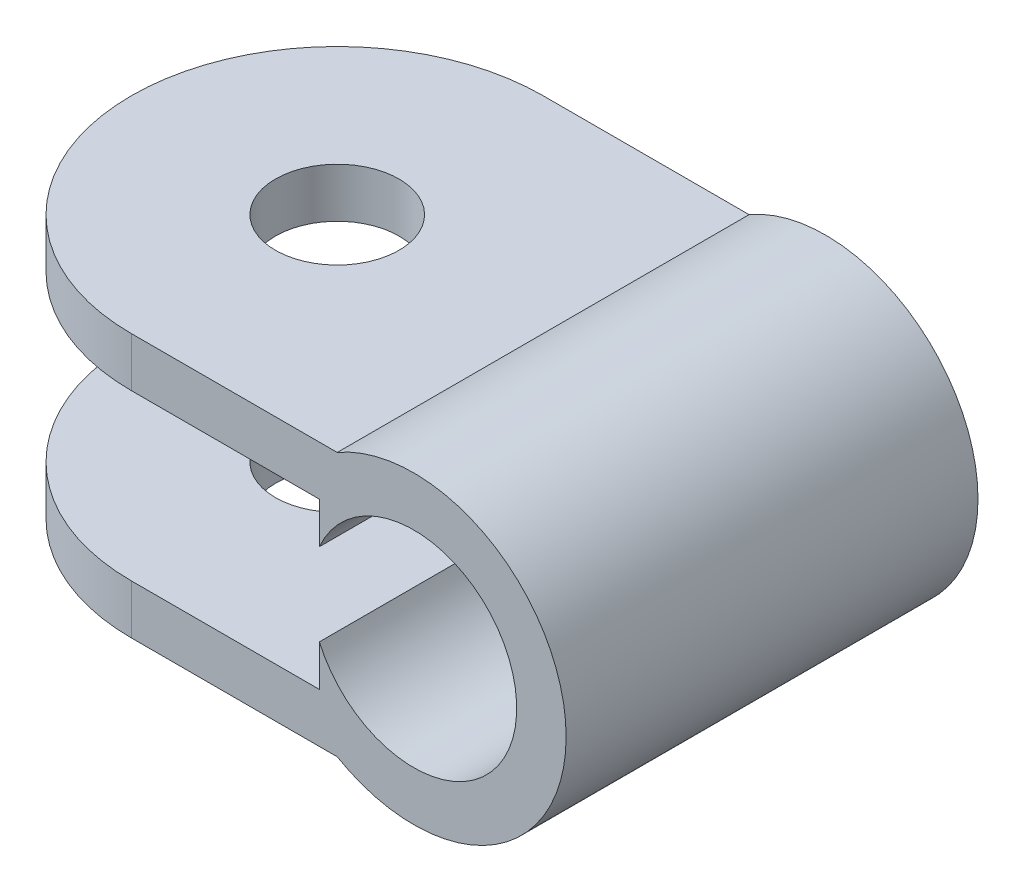
ISO-10303-21;
HEADER;
FILE_DESCRIPTION(('STEP AP214'),'2;1');
FILE_NAME('part.step','',(''),(''),'','','');
FILE_SCHEMA(('AUTOMOTIVE_DESIGN { 1 0 10303 214 1 1 1 1 }'));
ENDSEC;
DATA;
#1=APPLICATION_CONTEXT('core data for automotive mechanical design processes');
#2=APPLICATION_PROTOCOL_DEFINITION('international standard','automotive_design',2000,#1);
#3=PRODUCT_CONTEXT('',#1,'mechanical');
#4=PRODUCT('Part','Part','',(#3));
#5=PRODUCT_RELATED_PRODUCT_CATEGORY('part','',(#4));
#6=PRODUCT_DEFINITION_FORMATION('','',#4);
#7=PRODUCT_DEFINITION_CONTEXT('part definition',#1,'design');
#8=PRODUCT_DEFINITION('design','',#6,#7);
#9=PRODUCT_DEFINITION_SHAPE('','',#8);
#10=(LENGTH_UNIT() NAMED_UNIT(*) SI_UNIT(.MILLI.,.METRE.));
#11=(NAMED_UNIT(*) PLANE_ANGLE_UNIT() SI_UNIT($,.RADIAN.));
#12=(NAMED_UNIT(*) SI_UNIT($,.STERADIAN.) SOLID_ANGLE_UNIT());
#13=UNCERTAINTY_MEASURE_WITH_UNIT(LENGTH_MEASURE(1.E-05),#10,'distance_accuracy_value','');
#14=(GEOMETRIC_REPRESENTATION_CONTEXT(3) GLOBAL_UNCERTAINTY_ASSIGNED_CONTEXT((#13)) GLOBAL_UNIT_ASSIGNED_CONTEXT((#10,
#11,#12)) REPRESENTATION_CONTEXT('',''));
#15=CARTESIAN_POINT('',(0.,0.,0.));
#16=DIRECTION('',(0.,0.,1.));
#17=DIRECTION('',(1.,0.,0.));
#18=AXIS2_PLACEMENT_3D('',#15,#16,#17);
#19=CARTESIAN_POINT('',(0.,0.,5.));
#20=DIRECTION('',(0.,0.,-1.));
#21=DIRECTION('',(-1.,0.,0.));
#22=AXIS2_PLACEMENT_3D('',#19,#20,#21);
#23=CYLINDRICAL_SURFACE('',#22,2.5);
#24=CARTESIAN_POINT('',(0.,0.,-5.));
#25=DIRECTION('',(0.,0.,-1.));
#26=DIRECTION('',(-1.,0.,0.));
#27=AXIS2_PLACEMENT_3D('',#24,#25,#26);
#28=CIRCLE('',#27,2.5);
#29=CARTESIAN_POINT('',(-2.29128784747792,1.,-5.));
#30=VERTEX_POINT('',#29);
#31=CARTESIAN_POINT('',(-2.29128784747792,-1.,-5.));
#32=VERTEX_POINT('',#31);
#33=EDGE_CURVE('E157',#30,#32,#28,.T.);
#34=ORIENTED_EDGE('',*,*,#33,.T.);
#35=DIRECTION('',(0.,0.,-1.));
#36=VECTOR('',#35,1.);
#37=CARTESIAN_POINT('',(-2.29128784747792,-1.,5.));
#38=LINE('',#37,#36);
#39=CARTESIAN_POINT('',(-2.29128784747792,-1.,5.));
#40=VERTEX_POINT('',#39);
#41=EDGE_CURVE('E202',#40,#32,#38,.T.);
#42=ORIENTED_EDGE('',*,*,#41,.F.);
#43=CARTESIAN_POINT('',(0.,0.,5.));
#44=DIRECTION('',(0.,0.,-1.));
#45=DIRECTION('',(-1.,0.,0.));
#46=AXIS2_PLACEMENT_3D('',#43,#44,#45);
#47=CIRCLE('',#46,2.5);
#48=CARTESIAN_POINT('',(-2.29128784747792,1.,5.));
#49=VERTEX_POINT('',#48);
#50=EDGE_CURVE('E183',#49,#40,#47,.T.);
#51=ORIENTED_EDGE('',*,*,#50,.F.);
#52=DIRECTION('',(0.,0.,-1.));
#53=VECTOR('',#52,1.);
#54=CARTESIAN_POINT('',(-2.29128784747792,1.,5.));
#55=LINE('',#54,#53);
#56=EDGE_CURVE('E156',#49,#30,#55,.T.);
#57=ORIENTED_EDGE('',*,*,#56,.T.);
#58=EDGE_LOOP('',(#34,#42,#51,#57));
#59=FACE_BOUND('',#58,.T.);
#60=ADVANCED_FACE('F43',(#59),#23,.F.);
#61=CARTESIAN_POINT('',(-2.29128784747792,-1.,5.));
#62=DIRECTION('',(1.,0.,0.));
#63=DIRECTION('',(0.,1.,0.));
#64=AXIS2_PLACEMENT_3D('',#61,#62,#63);
#65=PLANE('',#64);
#66=DIRECTION('',(0.,-1.,0.));
#67=VECTOR('',#66,1.);
#68=CARTESIAN_POINT('',(-2.29128784747792,-1.,-5.));
#69=LINE('',#68,#67);
#70=CARTESIAN_POINT('',(-2.29128784747792,-2.,-5.));
#71=VERTEX_POINT('',#70);
#72=EDGE_CURVE('E161',#32,#71,#69,.T.);
#73=ORIENTED_EDGE('',*,*,#72,.T.);
#74=DIRECTION('',(0.,0.,-1.));
#75=VECTOR('',#74,1.);
#76=CARTESIAN_POINT('',(-2.29128784747792,-2.,5.));
#77=LINE('',#76,#75);
#78=CARTESIAN_POINT('',(-2.29128784747792,-2.,5.));
#79=VERTEX_POINT('',#78);
#80=EDGE_CURVE('E198',#79,#71,#77,.T.);
#81=ORIENTED_EDGE('',*,*,#80,.F.);
#82=DIRECTION('',(0.,-1.,0.));
#83=VECTOR('',#82,1.);
#84=CARTESIAN_POINT('',(-2.29128784747792,-1.,5.));
#85=LINE('',#84,#83);
#86=EDGE_CURVE('E249',#40,#79,#85,.T.);
#87=ORIENTED_EDGE('',*,*,#86,.F.);
#88=ORIENTED_EDGE('',*,*,#41,.T.);
#89=EDGE_LOOP('',(#73,#81,#87,#88));
#90=FACE_BOUND('',#89,.T.);
#91=ADVANCED_FACE('F236',(#90),#65,.F.);
#92=CARTESIAN_POINT('',(-2.29128784747792,-2.,5.));
#93=DIRECTION('',(0.,-1.,0.));
#94=DIRECTION('',(1.,0.,0.));
#95=AXIS2_PLACEMENT_3D('',#92,#93,#94);
#96=PLANE('',#95);
#97=CARTESIAN_POINT('',(-6.85741756210067,-2.,0.));
#98=DIRECTION('',(0.,-1.,0.));
#99=DIRECTION('',(1.,0.,0.));
#100=AXIS2_PLACEMENT_3D('',#97,#98,#99);
#101=CIRCLE('',#100,1.5);
#102=CARTESIAN_POINT('',(-5.35741756210067,-2.,0.));
#103=VERTEX_POINT('',#102);
#104=EDGE_CURVE('E162',#103,#103,#101,.T.);
#105=ORIENTED_EDGE('',*,*,#104,.T.);
#106=EDGE_LOOP('',(#105));
#107=FACE_BOUND('',#106,.T.);
#108=DIRECTION('',(-1.,0.,0.));
#109=VECTOR('',#108,1.);
#110=CARTESIAN_POINT('',(-2.29128784747792,-2.,-5.));
#111=LINE('',#110,#109);
#112=CARTESIAN_POINT('',(-6.85741756210067,-2.,-5.));
#113=VERTEX_POINT('',#112);
#114=EDGE_CURVE('E165',#71,#113,#111,.T.);
#115=ORIENTED_EDGE('',*,*,#114,.T.);
#116=CARTESIAN_POINT('',(-6.85741756210067,-2.,0.));
#117=DIRECTION('',(0.,-1.,0.));
#118=DIRECTION('',(1.,0.,0.));
#119=AXIS2_PLACEMENT_3D('',#116,#117,#118);
#120=CIRCLE('',#119,5.);
#121=CARTESIAN_POINT('',(-6.85741756210067,-2.,5.));
#122=VERTEX_POINT('',#121);
#123=EDGE_CURVE('E59',#113,#122,#120,.F.);
#124=ORIENTED_EDGE('',*,*,#123,.T.);
#125=DIRECTION('',(-1.,0.,0.));
#126=VECTOR('',#125,1.);
#127=CARTESIAN_POINT('',(-2.29128784747792,-2.,5.));
#128=LINE('',#127,#126);
#129=EDGE_CURVE('E254',#79,#122,#128,.T.);
#130=ORIENTED_EDGE('',*,*,#129,.F.);
#131=ORIENTED_EDGE('',*,*,#80,.T.);
#132=EDGE_LOOP('',(#115,#124,#130,#131));
#133=FACE_BOUND('',#132,.T.);
#134=ADVANCED_FACE('F232',(#107,#133),#96,.F.);
#135=CARTESIAN_POINT('',(-11.8574175621007,-3.2,5.));
#136=DIRECTION('',(0.,1.,0.));
#137=DIRECTION('',(-1.,0.,0.));
#138=AXIS2_PLACEMENT_3D('',#135,#136,#137);
#139=PLANE('',#138);
#140=CARTESIAN_POINT('',(-6.85741756210067,-3.2,0.));
#141=DIRECTION('',(0.,1.,0.));
#142=DIRECTION('',(-1.,0.,0.));
#143=AXIS2_PLACEMENT_3D('',#140,#141,#142);
#144=CIRCLE('',#143,1.5);
#145=CARTESIAN_POINT('',(-8.35741756210067,-3.2,0.));
#146=VERTEX_POINT('',#145);
#147=EDGE_CURVE('E272',#146,#146,#144,.T.);
#148=ORIENTED_EDGE('',*,*,#147,.T.);
#149=EDGE_LOOP('',(#148));
#150=FACE_BOUND('',#149,.T.);
#151=DIRECTION('',(1.,0.,0.));
#152=VECTOR('',#151,1.);
#153=CARTESIAN_POINT('',(-11.8574175621007,-3.2,5.));
#154=LINE('',#153,#152);
#155=CARTESIAN_POINT('',(-6.85741756210067,-3.2,5.));
#156=VERTEX_POINT('',#155);
#157=CARTESIAN_POINT('',(-1.85741756210067,-3.2,5.));
#158=VERTEX_POINT('',#157);
#159=EDGE_CURVE('E150',#156,#158,#154,.T.);
#160=ORIENTED_EDGE('',*,*,#159,.F.);
#161=CARTESIAN_POINT('',(-6.85741756210067,-3.2,0.));
#162=DIRECTION('',(0.,1.,0.));
#163=DIRECTION('',(-1.,0.,0.));
#164=AXIS2_PLACEMENT_3D('',#161,#162,#163);
#165=CIRCLE('',#164,5.);
#166=CARTESIAN_POINT('',(-6.85741756210067,-3.2,-5.));
#167=VERTEX_POINT('',#166);
#168=EDGE_CURVE('E208',#156,#167,#165,.F.);
#169=ORIENTED_EDGE('',*,*,#168,.T.);
#170=DIRECTION('',(1.,0.,0.));
#171=VECTOR('',#170,1.);
#172=CARTESIAN_POINT('',(-11.8574175621007,-3.2,-5.));
#173=LINE('',#172,#171);
#174=CARTESIAN_POINT('',(-1.85741756210067,-3.2,-5.));
#175=VERTEX_POINT('',#174);
#176=EDGE_CURVE('E169',#167,#175,#173,.T.);
#177=ORIENTED_EDGE('',*,*,#176,.T.);
#178=DIRECTION('',(0.,0.,-1.));
#179=VECTOR('',#178,1.);
#180=CARTESIAN_POINT('',(-1.85741756210067,-3.2,5.));
#181=LINE('',#180,#179);
#182=EDGE_CURVE('E194',#158,#175,#181,.T.);
#183=ORIENTED_EDGE('',*,*,#182,.F.);
#184=EDGE_LOOP('',(#160,#169,#177,#183));
#185=FACE_BOUND('',#184,.T.);
#186=ADVANCED_FACE('F215',(#150,#185),#139,.F.);
#187=CARTESIAN_POINT('',(0.,0.,5.));
#188=DIRECTION('',(0.,0.,-1.));
#189=DIRECTION('',(-1.,0.,0.));
#190=AXIS2_PLACEMENT_3D('',#187,#188,#189);
#191=CYLINDRICAL_SURFACE('',#190,3.7);
#192=CARTESIAN_POINT('',(0.,0.,-5.));
#193=DIRECTION('',(0.,0.,1.));
#194=DIRECTION('',(-1.,0.,0.));
#195=AXIS2_PLACEMENT_3D('',#192,#193,#194);
#196=CIRCLE('',#195,3.7);
#197=CARTESIAN_POINT('',(-1.85741756210067,3.2,-5.));
#198=VERTEX_POINT('',#197);
#199=EDGE_CURVE('E172',#175,#198,#196,.T.);
#200=ORIENTED_EDGE('',*,*,#199,.T.);
#201=DIRECTION('',(0.,0.,-1.));
#202=VECTOR('',#201,1.);
#203=CARTESIAN_POINT('',(-1.85741756210067,3.2,5.));
#204=LINE('',#203,#202);
#205=CARTESIAN_POINT('',(-1.85741756210067,3.2,5.));
#206=VERTEX_POINT('',#205);
#207=EDGE_CURVE('E191',#206,#198,#204,.T.);
#208=ORIENTED_EDGE('',*,*,#207,.F.);
#209=CARTESIAN_POINT('',(0.,0.,5.));
#210=DIRECTION('',(0.,0.,1.));
#211=DIRECTION('',(-1.,0.,0.));
#212=AXIS2_PLACEMENT_3D('',#209,#210,#211);
#213=CIRCLE('',#212,3.7);
#214=EDGE_CURVE('E141',#158,#206,#213,.T.);
#215=ORIENTED_EDGE('',*,*,#214,.F.);
#216=ORIENTED_EDGE('',*,*,#182,.T.);
#217=EDGE_LOOP('',(#200,#208,#215,#216));
#218=FACE_BOUND('',#217,.T.);
#219=ADVANCED_FACE('F222',(#218),#191,.T.);
#220=CARTESIAN_POINT('',(-11.8574175621007,3.2,5.));
#221=DIRECTION('',(0.,-1.,0.));
#222=DIRECTION('',(1.,0.,0.));
#223=AXIS2_PLACEMENT_3D('',#220,#221,#222);
#224=PLANE('',#223);
#225=CARTESIAN_POINT('',(-6.85741756210067,3.2,0.));
#226=DIRECTION('',(0.,1.,0.));
#227=DIRECTION('',(-1.,0.,0.));
#228=AXIS2_PLACEMENT_3D('',#225,#226,#227);
#229=CIRCLE('',#228,1.5);
#230=CARTESIAN_POINT('',(-8.35741756210067,3.2,0.));
#231=VERTEX_POINT('',#230);
#232=EDGE_CURVE('E137',#231,#231,#229,.T.);
#233=ORIENTED_EDGE('',*,*,#232,.F.);
#234=EDGE_LOOP('',(#233));
#235=FACE_BOUND('',#234,.T.);
#236=DIRECTION('',(-1.,0.,0.));
#237=VECTOR('',#236,1.);
#238=CARTESIAN_POINT('',(-11.8574175621007,3.2,-5.));
#239=LINE('',#238,#237);
#240=CARTESIAN_POINT('',(-6.85741756210067,3.2,-5.));
#241=VERTEX_POINT('',#240);
#242=EDGE_CURVE('E135',#198,#241,#239,.T.);
#243=ORIENTED_EDGE('',*,*,#242,.T.);
#244=CARTESIAN_POINT('',(-6.85741756210067,3.2,0.));
#245=DIRECTION('',(0.,-1.,0.));
#246=DIRECTION('',(1.,0.,0.));
#247=AXIS2_PLACEMENT_3D('',#244,#245,#246);
#248=CIRCLE('',#247,5.);
#249=CARTESIAN_POINT('',(-6.85741756210067,3.2,5.));
#250=VERTEX_POINT('',#249);
#251=EDGE_CURVE('E66',#250,#241,#248,.T.);
#252=ORIENTED_EDGE('',*,*,#251,.F.);
#253=DIRECTION('',(-1.,0.,0.));
#254=VECTOR('',#253,1.);
#255=CARTESIAN_POINT('',(-11.8574175621007,3.2,5.));
#256=LINE('',#255,#254);
#257=EDGE_CURVE('E133',#206,#250,#256,.T.);
#258=ORIENTED_EDGE('',*,*,#257,.F.);
#259=ORIENTED_EDGE('',*,*,#207,.T.);
#260=EDGE_LOOP('',(#243,#252,#258,#259));
#261=FACE_BOUND('',#260,.T.);
#262=ADVANCED_FACE('F131',(#235,#261),#224,.F.);
#263=CARTESIAN_POINT('',(-2.29128784747792,2.,5.));
#264=DIRECTION('',(0.,1.,0.));
#265=DIRECTION('',(-1.,0.,0.));
#266=AXIS2_PLACEMENT_3D('',#263,#264,#265);
#267=PLANE('',#266);
#268=CARTESIAN_POINT('',(-6.85741756210067,2.,0.));
#269=DIRECTION('',(0.,1.,0.));
#270=DIRECTION('',(-1.,0.,0.));
#271=AXIS2_PLACEMENT_3D('',#268,#269,#270);
#272=CIRCLE('',#271,1.5);
#273=CARTESIAN_POINT('',(-8.35741756210067,2.,0.));
#274=VERTEX_POINT('',#273);
#275=EDGE_CURVE('E46',#274,#274,#272,.T.);
#276=ORIENTED_EDGE('',*,*,#275,.T.);
#277=EDGE_LOOP('',(#276));
#278=FACE_BOUND('',#277,.T.);
#279=DIRECTION('',(1.,0.,0.));
#280=VECTOR('',#279,1.);
#281=CARTESIAN_POINT('',(-2.29128784747792,2.,5.));
#282=LINE('',#281,#280);
#283=CARTESIAN_POINT('',(-6.85741756210067,2.,5.));
#284=VERTEX_POINT('',#283);
#285=CARTESIAN_POINT('',(-2.29128784747792,2.,5.));
#286=VERTEX_POINT('',#285);
#287=EDGE_CURVE('E144',#284,#286,#282,.T.);
#288=ORIENTED_EDGE('',*,*,#287,.F.);
#289=CARTESIAN_POINT('',(-6.85741756210067,2.,0.));
#290=DIRECTION('',(0.,1.,0.));
#291=DIRECTION('',(-1.,0.,0.));
#292=AXIS2_PLACEMENT_3D('',#289,#290,#291);
#293=CIRCLE('',#292,5.);
#294=CARTESIAN_POINT('',(-6.85741756210067,2.,-5.));
#295=VERTEX_POINT('',#294);
#296=EDGE_CURVE('E121',#284,#295,#293,.F.);
#297=ORIENTED_EDGE('',*,*,#296,.T.);
#298=DIRECTION('',(1.,0.,0.));
#299=VECTOR('',#298,1.);
#300=CARTESIAN_POINT('',(-2.29128784747792,2.,-5.));
#301=LINE('',#300,#299);
#302=CARTESIAN_POINT('',(-2.29128784747792,2.,-5.));
#303=VERTEX_POINT('',#302);
#304=EDGE_CURVE('E177',#295,#303,#301,.T.);
#305=ORIENTED_EDGE('',*,*,#304,.T.);
#306=DIRECTION('',(0.,0.,-1.));
#307=VECTOR('',#306,1.);
#308=CARTESIAN_POINT('',(-2.29128784747792,2.,5.));
#309=LINE('',#308,#307);
#310=EDGE_CURVE('E187',#286,#303,#309,.T.);
#311=ORIENTED_EDGE('',*,*,#310,.F.);
#312=EDGE_LOOP('',(#288,#297,#305,#311));
#313=FACE_BOUND('',#312,.T.);
#314=ADVANCED_FACE('F229',(#278,#313),#267,.F.);
#315=CARTESIAN_POINT('',(-2.29128784747792,1.,5.));
#316=DIRECTION('',(1.,0.,0.));
#317=DIRECTION('',(0.,0.,-1.));
#318=AXIS2_PLACEMENT_3D('',#315,#316,#317);
#319=PLANE('',#318);
#320=DIRECTION('',(0.,-1.,0.));
#321=VECTOR('',#320,1.);
#322=CARTESIAN_POINT('',(-2.29128784747792,1.,-5.));
#323=LINE('',#322,#321);
#324=EDGE_CURVE('E180',#303,#30,#323,.T.);
#325=ORIENTED_EDGE('',*,*,#324,.T.);
#326=ORIENTED_EDGE('',*,*,#56,.F.);
#327=DIRECTION('',(0.,-1.,0.));
#328=VECTOR('',#327,1.);
#329=CARTESIAN_POINT('',(-2.29128784747792,1.,5.));
#330=LINE('',#329,#328);
#331=EDGE_CURVE('E148',#286,#49,#330,.T.);
#332=ORIENTED_EDGE('',*,*,#331,.F.);
#333=ORIENTED_EDGE('',*,*,#310,.T.);
#334=EDGE_LOOP('',(#325,#326,#332,#333));
#335=FACE_BOUND('',#334,.T.);
#336=ADVANCED_FACE('F298',(#335),#319,.F.);
#337=CARTESIAN_POINT('',(0.,0.,5.));
#338=DIRECTION('',(0.,0.,-1.));
#339=DIRECTION('',(-1.,0.,0.));
#340=AXIS2_PLACEMENT_3D('',#337,#338,#339);
#341=PLANE('',#340);
#342=ORIENTED_EDGE('',*,*,#257,.T.);
#343=DIRECTION('',(0.,1.,0.));
#344=VECTOR('',#343,1.);
#345=CARTESIAN_POINT('',(-6.85741756210067,-6.8,5.));
#346=LINE('',#345,#344);
#347=EDGE_CURVE('E118',#284,#250,#346,.T.);
#348=ORIENTED_EDGE('',*,*,#347,.F.);
#349=ORIENTED_EDGE('',*,*,#287,.T.);
#350=ORIENTED_EDGE('',*,*,#331,.T.);
#351=ORIENTED_EDGE('',*,*,#50,.T.);
#352=ORIENTED_EDGE('',*,*,#86,.T.);
#353=ORIENTED_EDGE('',*,*,#129,.T.);
#354=EDGE_CURVE('E126',#156,#122,#346,.T.);
#355=ORIENTED_EDGE('',*,*,#354,.F.);
#356=ORIENTED_EDGE('',*,*,#159,.T.);
#357=ORIENTED_EDGE('',*,*,#214,.T.);
#358=EDGE_LOOP('',(#342,#348,#349,#350,#351,#352,#353,#355,#356,#357));
#359=FACE_BOUND('',#358,.T.);
#360=ADVANCED_FACE('F139',(#359),#341,.F.);
#361=CARTESIAN_POINT('',(0.,0.,-5.));
#362=DIRECTION('',(0.,0.,-1.));
#363=DIRECTION('',(-1.,0.,0.));
#364=AXIS2_PLACEMENT_3D('',#361,#362,#363);
#365=PLANE('',#364);
#366=DIRECTION('',(0.,1.,0.));
#367=VECTOR('',#366,1.);
#368=CARTESIAN_POINT('',(-6.85741756210067,-6.8,-5.));
#369=LINE('',#368,#367);
#370=EDGE_CURVE('E11',#241,#295,#369,.F.);
#371=ORIENTED_EDGE('',*,*,#370,.F.);
#372=ORIENTED_EDGE('',*,*,#242,.F.);
#373=ORIENTED_EDGE('',*,*,#199,.F.);
#374=ORIENTED_EDGE('',*,*,#176,.F.);
#375=EDGE_CURVE('E52',#113,#167,#369,.F.);
#376=ORIENTED_EDGE('',*,*,#375,.F.);
#377=ORIENTED_EDGE('',*,*,#114,.F.);
#378=ORIENTED_EDGE('',*,*,#72,.F.);
#379=ORIENTED_EDGE('',*,*,#33,.F.);
#380=ORIENTED_EDGE('',*,*,#324,.F.);
#381=ORIENTED_EDGE('',*,*,#304,.F.);
#382=EDGE_LOOP('',(#371,#372,#373,#374,#376,#377,#378,#379,#380,#381));
#383=FACE_BOUND('',#382,.T.);
#384=ADVANCED_FACE('F220',(#383),#365,.T.);
#385=CARTESIAN_POINT('',(-6.85741756210067,-6.8,0.));
#386=DIRECTION('',(0.,1.,0.));
#387=DIRECTION('',(-1.,0.,0.));
#388=AXIS2_PLACEMENT_3D('',#385,#386,#387);
#389=CYLINDRICAL_SURFACE('',#388,5.);
#390=ORIENTED_EDGE('',*,*,#375,.T.);
#391=ORIENTED_EDGE('',*,*,#168,.F.);
#392=ORIENTED_EDGE('',*,*,#354,.T.);
#393=ORIENTED_EDGE('',*,*,#123,.F.);
#394=EDGE_LOOP('',(#390,#391,#392,#393));
#395=FACE_BOUND('',#394,.T.);
#396=ADVANCED_FACE('F207',(#395),#389,.T.);
#397=ORIENTED_EDGE('',*,*,#251,.T.);
#398=ORIENTED_EDGE('',*,*,#370,.T.);
#399=ORIENTED_EDGE('',*,*,#296,.F.);
#400=ORIENTED_EDGE('',*,*,#347,.T.);
#401=EDGE_LOOP('',(#397,#398,#399,#400));
#402=FACE_BOUND('',#401,.T.);
#403=ADVANCED_FACE('F119',(#402),#389,.T.);
#404=CARTESIAN_POINT('',(-6.85741756210067,-6.8,0.));
#405=DIRECTION('',(0.,1.,0.));
#406=DIRECTION('',(-1.,0.,0.));
#407=AXIS2_PLACEMENT_3D('',#404,#405,#406);
#408=CYLINDRICAL_SURFACE('',#407,1.5);
#409=ORIENTED_EDGE('',*,*,#232,.T.);
#410=EDGE_LOOP('',(#409));
#411=FACE_BOUND('',#410,.T.);
#412=ORIENTED_EDGE('',*,*,#275,.F.);
#413=EDGE_LOOP('',(#412));
#414=FACE_BOUND('',#413,.T.);
#415=ADVANCED_FACE('F284',(#411,#414),#408,.F.);
#416=ORIENTED_EDGE('',*,*,#147,.F.);
#417=EDGE_LOOP('',(#416));
#418=FACE_BOUND('',#417,.T.);
#419=ORIENTED_EDGE('',*,*,#104,.F.);
#420=EDGE_LOOP('',(#419));
#421=FACE_BOUND('',#420,.T.);
#422=ADVANCED_FACE('F286',(#418,#421),#408,.F.);
#423=CLOSED_SHELL('',(#60,#91,#134,#186,#219,#262,#314,#336,#360,#384,#396,#403,#415,#422));
#424=MANIFOLD_SOLID_BREP('B2',#423);
#425=ADVANCED_BREP_SHAPE_REPRESENTATION('',(#18,#424),#14);
#426=SHAPE_DEFINITION_REPRESENTATION(#9,#425);
ENDSEC;
END-ISO-10303-21;
